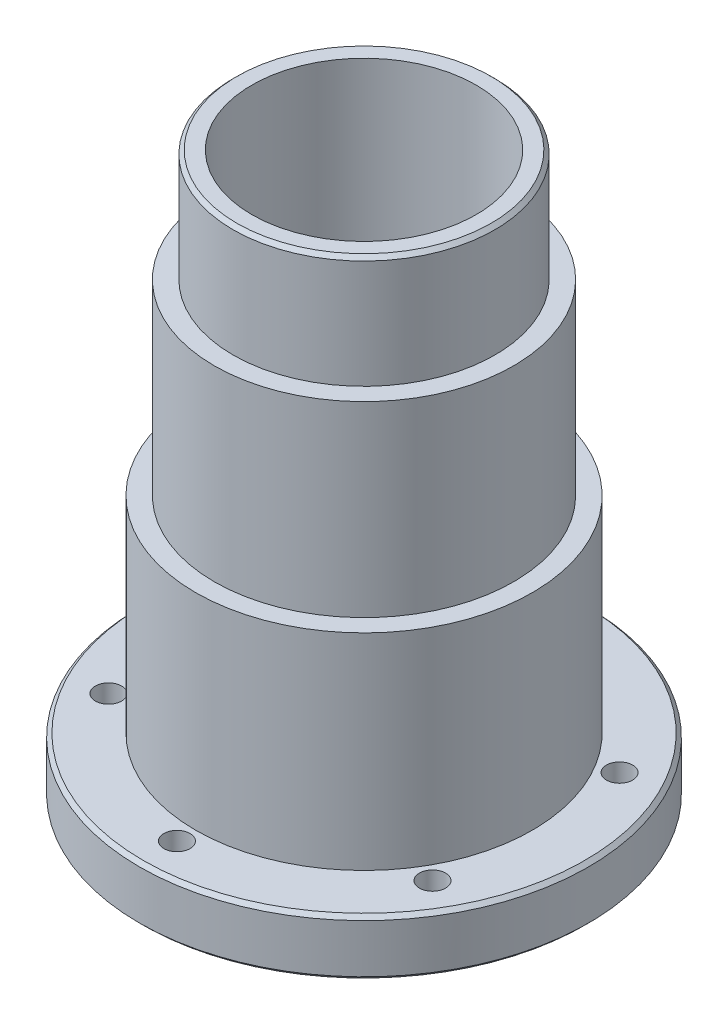
ISO-10303-21;
HEADER;
FILE_DESCRIPTION(('STEP AP214'),'2;1');
FILE_NAME('part.step','',(''),(''),'','','');
FILE_SCHEMA(('AUTOMOTIVE_DESIGN { 1 0 10303 214 1 1 1 1 }'));
ENDSEC;
DATA;
#1=APPLICATION_CONTEXT('core data for automotive mechanical design processes');
#2=APPLICATION_PROTOCOL_DEFINITION('international standard','automotive_design',2000,#1);
#3=PRODUCT_CONTEXT('',#1,'mechanical');
#4=PRODUCT('Part','Part','',(#3));
#5=PRODUCT_RELATED_PRODUCT_CATEGORY('part','',(#4));
#6=PRODUCT_DEFINITION_FORMATION('','',#4);
#7=PRODUCT_DEFINITION_CONTEXT('part definition',#1,'design');
#8=PRODUCT_DEFINITION('design','',#6,#7);
#9=PRODUCT_DEFINITION_SHAPE('','',#8);
#10=(LENGTH_UNIT() NAMED_UNIT(*) SI_UNIT(.MILLI.,.METRE.));
#11=(NAMED_UNIT(*) PLANE_ANGLE_UNIT() SI_UNIT($,.RADIAN.));
#12=(NAMED_UNIT(*) SI_UNIT($,.STERADIAN.) SOLID_ANGLE_UNIT());
#13=UNCERTAINTY_MEASURE_WITH_UNIT(LENGTH_MEASURE(1.E-05),#10,'distance_accuracy_value','');
#14=(GEOMETRIC_REPRESENTATION_CONTEXT(3) GLOBAL_UNCERTAINTY_ASSIGNED_CONTEXT((#13)) GLOBAL_UNIT_ASSIGNED_CONTEXT((#10,
#11,#12)) REPRESENTATION_CONTEXT('',''));
#15=CARTESIAN_POINT('',(0.,0.,0.));
#16=DIRECTION('',(0.,0.,1.));
#17=DIRECTION('',(1.,0.,0.));
#18=AXIS2_PLACEMENT_3D('',#15,#16,#17);
#19=CARTESIAN_POINT('',(0.,75.,17.5));
#20=DIRECTION('',(0.,1.,0.));
#21=DIRECTION('',(0.,0.,1.));
#22=AXIS2_PLACEMENT_3D('',#19,#20,#21);
#23=PLANE('',#22);
#24=CARTESIAN_POINT('',(0.,75.,0.));
#25=DIRECTION('',(0.,1.,0.));
#26=DIRECTION('',(0.,0.,1.));
#27=AXIS2_PLACEMENT_3D('',#24,#25,#26);
#28=CIRCLE('',#27,17.);
#29=CARTESIAN_POINT('',(0.,75.,17.));
#30=VERTEX_POINT('',#29);
#31=EDGE_CURVE('E44',#30,#30,#28,.T.);
#32=ORIENTED_EDGE('',*,*,#31,.T.);
#33=EDGE_LOOP('',(#32));
#34=FACE_BOUND('',#33,.T.);
#35=CARTESIAN_POINT('',(0.,75.,0.));
#36=DIRECTION('',(0.,1.,0.));
#37=DIRECTION('',(0.,0.,1.));
#38=AXIS2_PLACEMENT_3D('',#35,#36,#37);
#39=CIRCLE('',#38,15.);
#40=CARTESIAN_POINT('',(0.,75.,15.));
#41=VERTEX_POINT('',#40);
#42=EDGE_CURVE('E63',#41,#41,#39,.T.);
#43=ORIENTED_EDGE('',*,*,#42,.F.);
#44=EDGE_LOOP('',(#43));
#45=FACE_BOUND('',#44,.T.);
#46=ADVANCED_FACE('F36',(#34,#45),#23,.T.);
#47=CARTESIAN_POINT('',(0.,44.,0.));
#48=DIRECTION('',(0.,1.,0.));
#49=DIRECTION('',(0.,0.,1.));
#50=AXIS2_PLACEMENT_3D('',#47,#48,#49);
#51=CYLINDRICAL_SURFACE('',#50,15.);
#52=ORIENTED_EDGE('',*,*,#42,.T.);
#53=EDGE_LOOP('',(#52));
#54=FACE_BOUND('',#53,.T.);
#55=CARTESIAN_POINT('',(0.,0.,0.));
#56=DIRECTION('',(0.,1.,0.));
#57=DIRECTION('',(0.,0.,1.));
#58=AXIS2_PLACEMENT_3D('',#55,#56,#57);
#59=CIRCLE('',#58,15.);
#60=CARTESIAN_POINT('',(0.,0.,15.));
#61=VERTEX_POINT('',#60);
#62=EDGE_CURVE('E96',#61,#61,#59,.T.);
#63=ORIENTED_EDGE('',*,*,#62,.F.);
#64=EDGE_LOOP('',(#63));
#65=FACE_BOUND('',#64,.T.);
#66=ADVANCED_FACE('F163',(#54,#65),#51,.F.);
#67=CARTESIAN_POINT('',(0.,0.,15.));
#68=DIRECTION('',(0.,-1.,0.));
#69=DIRECTION('',(0.,0.,-1.));
#70=AXIS2_PLACEMENT_3D('',#67,#68,#69);
#71=PLANE('',#70);
#72=CARTESIAN_POINT('',(0.,0.,0.));
#73=DIRECTION('',(0.,-1.,0.));
#74=DIRECTION('',(0.,0.,-1.));
#75=AXIS2_PLACEMENT_3D('',#72,#73,#74);
#76=CIRCLE('',#75,29.5);
#77=CARTESIAN_POINT('',(0.,0.,-29.5));
#78=VERTEX_POINT('',#77);
#79=EDGE_CURVE('E48',#78,#78,#76,.T.);
#80=ORIENTED_EDGE('',*,*,#79,.T.);
#81=EDGE_LOOP('',(#80));
#82=FACE_BOUND('',#81,.T.);
#83=CARTESIAN_POINT('',(-21.6506350946108,0.,12.5000000000003));
#84=DIRECTION('',(0.,-1.,0.));
#85=DIRECTION('',(0.,0.,-1.));
#86=AXIS2_PLACEMENT_3D('',#83,#84,#85);
#87=CIRCLE('',#86,3.);
#88=CARTESIAN_POINT('',(-21.6506350946108,0.,9.50000000000025));
#89=VERTEX_POINT('',#88);
#90=EDGE_CURVE('E153',#89,#89,#87,.T.);
#91=ORIENTED_EDGE('',*,*,#90,.F.);
#92=EDGE_LOOP('',(#91));
#93=FACE_BOUND('',#92,.T.);
#94=CARTESIAN_POINT('',(-21.6506350946111,0.,-12.4999999999998));
#95=DIRECTION('',(0.,-1.,0.));
#96=DIRECTION('',(0.,0.,-1.));
#97=AXIS2_PLACEMENT_3D('',#94,#95,#96);
#98=CIRCLE('',#97,3.);
#99=CARTESIAN_POINT('',(-21.6506350946111,0.,-15.4999999999998));
#100=VERTEX_POINT('',#99);
#101=EDGE_CURVE('E67',#100,#100,#98,.T.);
#102=ORIENTED_EDGE('',*,*,#101,.F.);
#103=EDGE_LOOP('',(#102));
#104=FACE_BOUND('',#103,.T.);
#105=CARTESIAN_POINT('',(0.,0.,-25.));
#106=DIRECTION('',(0.,-1.,0.));
#107=DIRECTION('',(0.,0.,-1.));
#108=AXIS2_PLACEMENT_3D('',#105,#106,#107);
#109=CIRCLE('',#108,3.);
#110=CARTESIAN_POINT('',(0.,0.,-28.));
#111=VERTEX_POINT('',#110);
#112=EDGE_CURVE('E72',#111,#111,#109,.T.);
#113=ORIENTED_EDGE('',*,*,#112,.F.);
#114=EDGE_LOOP('',(#113));
#115=FACE_BOUND('',#114,.T.);
#116=CARTESIAN_POINT('',(21.6506350946109,0.,-12.5000000000001));
#117=DIRECTION('',(0.,-1.,0.));
#118=DIRECTION('',(0.,0.,-1.));
#119=AXIS2_PLACEMENT_3D('',#116,#117,#118);
#120=CIRCLE('',#119,3.);
#121=CARTESIAN_POINT('',(21.6506350946109,0.,-15.5000000000001));
#122=VERTEX_POINT('',#121);
#123=EDGE_CURVE('E77',#122,#122,#120,.T.);
#124=ORIENTED_EDGE('',*,*,#123,.F.);
#125=EDGE_LOOP('',(#124));
#126=FACE_BOUND('',#125,.T.);
#127=CARTESIAN_POINT('',(21.650635094611,0.,12.5));
#128=DIRECTION('',(0.,-1.,0.));
#129=DIRECTION('',(0.,0.,-1.));
#130=AXIS2_PLACEMENT_3D('',#127,#128,#129);
#131=CIRCLE('',#130,3.);
#132=CARTESIAN_POINT('',(21.650635094611,0.,9.49999999999995));
#133=VERTEX_POINT('',#132);
#134=EDGE_CURVE('E82',#133,#133,#131,.T.);
#135=ORIENTED_EDGE('',*,*,#134,.F.);
#136=EDGE_LOOP('',(#135));
#137=FACE_BOUND('',#136,.T.);
#138=CARTESIAN_POINT('',(0.,0.,25.));
#139=DIRECTION('',(0.,-1.,0.));
#140=DIRECTION('',(0.,0.,-1.));
#141=AXIS2_PLACEMENT_3D('',#138,#139,#140);
#142=CIRCLE('',#141,3.);
#143=CARTESIAN_POINT('',(0.,0.,22.));
#144=VERTEX_POINT('',#143);
#145=EDGE_CURVE('E87',#144,#144,#142,.T.);
#146=ORIENTED_EDGE('',*,*,#145,.F.);
#147=EDGE_LOOP('',(#146));
#148=FACE_BOUND('',#147,.T.);
#149=ORIENTED_EDGE('',*,*,#62,.T.);
#150=EDGE_LOOP('',(#149));
#151=FACE_BOUND('',#150,.T.);
#152=ADVANCED_FACE('F159',(#82,#93,#104,#115,#126,#137,#148,#151),#71,.T.);
#153=CARTESIAN_POINT('',(0.,44.,0.));
#154=DIRECTION('',(0.,1.,0.));
#155=DIRECTION('',(0.,0.,1.));
#156=AXIS2_PLACEMENT_3D('',#153,#154,#155);
#157=CYLINDRICAL_SURFACE('',#156,30.);
#158=CARTESIAN_POINT('',(0.,7.00000000000003,0.));
#159=DIRECTION('',(0.,1.,0.));
#160=DIRECTION('',(0.,0.,1.));
#161=AXIS2_PLACEMENT_3D('',#158,#159,#160);
#162=CIRCLE('',#161,30.);
#163=CARTESIAN_POINT('',(0.,7.00000000000003,30.));
#164=VERTEX_POINT('',#163);
#165=EDGE_CURVE('E52',#164,#164,#162,.F.);
#166=ORIENTED_EDGE('',*,*,#165,.T.);
#167=EDGE_LOOP('',(#166));
#168=FACE_BOUND('',#167,.T.);
#169=CARTESIAN_POINT('',(0.,0.499999999999994,0.));
#170=DIRECTION('',(0.,-1.,0.));
#171=DIRECTION('',(0.,0.,-1.));
#172=AXIS2_PLACEMENT_3D('',#169,#170,#171);
#173=CIRCLE('',#172,30.);
#174=CARTESIAN_POINT('',(0.,0.499999999999994,-30.));
#175=VERTEX_POINT('',#174);
#176=EDGE_CURVE('E57',#175,#175,#173,.F.);
#177=ORIENTED_EDGE('',*,*,#176,.T.);
#178=EDGE_LOOP('',(#177));
#179=FACE_BOUND('',#178,.T.);
#180=ADVANCED_FACE('F162',(#168,#179),#157,.T.);
#181=CARTESIAN_POINT('',(0.,7.5,30.));
#182=DIRECTION('',(0.,1.,0.));
#183=DIRECTION('',(0.,0.,1.));
#184=AXIS2_PLACEMENT_3D('',#181,#182,#183);
#185=PLANE('',#184);
#186=CARTESIAN_POINT('',(0.,7.5,0.));
#187=DIRECTION('',(0.,1.,0.));
#188=DIRECTION('',(0.,0.,1.));
#189=AXIS2_PLACEMENT_3D('',#186,#187,#188);
#190=CIRCLE('',#189,29.5);
#191=CARTESIAN_POINT('',(0.,7.5,29.5));
#192=VERTEX_POINT('',#191);
#193=EDGE_CURVE('E60',#192,#192,#190,.T.);
#194=ORIENTED_EDGE('',*,*,#193,.T.);
#195=EDGE_LOOP('',(#194));
#196=FACE_BOUND('',#195,.T.);
#197=CARTESIAN_POINT('',(-21.6506350946108,7.5,12.5000000000003));
#198=DIRECTION('',(0.,1.,0.));
#199=DIRECTION('',(0.,0.,1.));
#200=AXIS2_PLACEMENT_3D('',#197,#198,#199);
#201=CIRCLE('',#200,1.74999999999999);
#202=CARTESIAN_POINT('',(-21.6506350946108,7.5,14.2500000000002));
#203=VERTEX_POINT('',#202);
#204=EDGE_CURVE('E64',#203,#203,#201,.T.);
#205=ORIENTED_EDGE('',*,*,#204,.F.);
#206=EDGE_LOOP('',(#205));
#207=FACE_BOUND('',#206,.T.);
#208=CARTESIAN_POINT('',(-21.6506350946111,7.5,-12.4999999999998));
#209=DIRECTION('',(0.,1.,0.));
#210=DIRECTION('',(0.,0.,1.));
#211=AXIS2_PLACEMENT_3D('',#208,#209,#210);
#212=CIRCLE('',#211,1.74999999999999);
#213=CARTESIAN_POINT('',(-21.6506350946111,7.5,-10.7499999999998));
#214=VERTEX_POINT('',#213);
#215=EDGE_CURVE('E69',#214,#214,#212,.T.);
#216=ORIENTED_EDGE('',*,*,#215,.F.);
#217=EDGE_LOOP('',(#216));
#218=FACE_BOUND('',#217,.T.);
#219=CARTESIAN_POINT('',(0.,7.5,-25.));
#220=DIRECTION('',(0.,1.,0.));
#221=DIRECTION('',(0.,0.,1.));
#222=AXIS2_PLACEMENT_3D('',#219,#220,#221);
#223=CIRCLE('',#222,1.74999999999999);
#224=CARTESIAN_POINT('',(0.,7.5,-23.25));
#225=VERTEX_POINT('',#224);
#226=EDGE_CURVE('E74',#225,#225,#223,.T.);
#227=ORIENTED_EDGE('',*,*,#226,.F.);
#228=EDGE_LOOP('',(#227));
#229=FACE_BOUND('',#228,.T.);
#230=CARTESIAN_POINT('',(21.6506350946109,7.5,-12.5000000000001));
#231=DIRECTION('',(0.,1.,0.));
#232=DIRECTION('',(0.,0.,1.));
#233=AXIS2_PLACEMENT_3D('',#230,#231,#232);
#234=CIRCLE('',#233,1.74999999999999);
#235=CARTESIAN_POINT('',(21.6506350946109,7.5,-10.7500000000001));
#236=VERTEX_POINT('',#235);
#237=EDGE_CURVE('E79',#236,#236,#234,.T.);
#238=ORIENTED_EDGE('',*,*,#237,.F.);
#239=EDGE_LOOP('',(#238));
#240=FACE_BOUND('',#239,.T.);
#241=CARTESIAN_POINT('',(21.650635094611,7.5,12.5));
#242=DIRECTION('',(0.,1.,0.));
#243=DIRECTION('',(0.,0.,1.));
#244=AXIS2_PLACEMENT_3D('',#241,#242,#243);
#245=CIRCLE('',#244,1.74999999999999);
#246=CARTESIAN_POINT('',(21.650635094611,7.5,14.2499999999999));
#247=VERTEX_POINT('',#246);
#248=EDGE_CURVE('E84',#247,#247,#245,.T.);
#249=ORIENTED_EDGE('',*,*,#248,.F.);
#250=EDGE_LOOP('',(#249));
#251=FACE_BOUND('',#250,.T.);
#252=CARTESIAN_POINT('',(0.,7.5,25.));
#253=DIRECTION('',(0.,1.,0.));
#254=DIRECTION('',(0.,0.,1.));
#255=AXIS2_PLACEMENT_3D('',#252,#253,#254);
#256=CIRCLE('',#255,1.74999999999999);
#257=CARTESIAN_POINT('',(0.,7.5,26.75));
#258=VERTEX_POINT('',#257);
#259=EDGE_CURVE('E89',#258,#258,#256,.T.);
#260=ORIENTED_EDGE('',*,*,#259,.F.);
#261=EDGE_LOOP('',(#260));
#262=FACE_BOUND('',#261,.T.);
#263=CARTESIAN_POINT('',(0.,7.5,0.));
#264=DIRECTION('',(0.,1.,0.));
#265=DIRECTION('',(0.,0.,1.));
#266=AXIS2_PLACEMENT_3D('',#263,#264,#265);
#267=CIRCLE('',#266,22.5);
#268=CARTESIAN_POINT('',(0.,7.5,22.5));
#269=VERTEX_POINT('',#268);
#270=EDGE_CURVE('E99',#269,#269,#267,.T.);
#271=ORIENTED_EDGE('',*,*,#270,.F.);
#272=EDGE_LOOP('',(#271));
#273=FACE_BOUND('',#272,.T.);
#274=ADVANCED_FACE('F208',(#196,#207,#218,#229,#240,#251,#262,#273),#185,.T.);
#275=CARTESIAN_POINT('',(0.,44.,0.));
#276=DIRECTION('',(0.,1.,0.));
#277=DIRECTION('',(0.,0.,1.));
#278=AXIS2_PLACEMENT_3D('',#275,#276,#277);
#279=CYLINDRICAL_SURFACE('',#278,22.5);
#280=ORIENTED_EDGE('',*,*,#270,.T.);
#281=EDGE_LOOP('',(#280));
#282=FACE_BOUND('',#281,.T.);
#283=CARTESIAN_POINT('',(0.,35.,0.));
#284=DIRECTION('',(0.,1.,0.));
#285=DIRECTION('',(0.,0.,1.));
#286=AXIS2_PLACEMENT_3D('',#283,#284,#285);
#287=CIRCLE('',#286,22.5);
#288=CARTESIAN_POINT('',(0.,35.,22.5));
#289=VERTEX_POINT('',#288);
#290=EDGE_CURVE('E102',#289,#289,#287,.T.);
#291=ORIENTED_EDGE('',*,*,#290,.F.);
#292=EDGE_LOOP('',(#291));
#293=FACE_BOUND('',#292,.T.);
#294=ADVANCED_FACE('F213',(#282,#293),#279,.T.);
#295=CARTESIAN_POINT('',(0.,35.,22.5));
#296=DIRECTION('',(0.,1.,0.));
#297=DIRECTION('',(0.,0.,1.));
#298=AXIS2_PLACEMENT_3D('',#295,#296,#297);
#299=PLANE('',#298);
#300=ORIENTED_EDGE('',*,*,#290,.T.);
#301=EDGE_LOOP('',(#300));
#302=FACE_BOUND('',#301,.T.);
#303=CARTESIAN_POINT('',(0.,35.,0.));
#304=DIRECTION('',(0.,1.,0.));
#305=DIRECTION('',(0.,0.,1.));
#306=AXIS2_PLACEMENT_3D('',#303,#304,#305);
#307=CIRCLE('',#306,20.);
#308=CARTESIAN_POINT('',(0.,35.,20.));
#309=VERTEX_POINT('',#308);
#310=EDGE_CURVE('E105',#309,#309,#307,.T.);
#311=ORIENTED_EDGE('',*,*,#310,.F.);
#312=EDGE_LOOP('',(#311));
#313=FACE_BOUND('',#312,.T.);
#314=ADVANCED_FACE('F219',(#302,#313),#299,.T.);
#315=CARTESIAN_POINT('',(0.,44.,0.));
#316=DIRECTION('',(0.,1.,0.));
#317=DIRECTION('',(0.,0.,1.));
#318=AXIS2_PLACEMENT_3D('',#315,#316,#317);
#319=CYLINDRICAL_SURFACE('',#318,20.);
#320=ORIENTED_EDGE('',*,*,#310,.T.);
#321=EDGE_LOOP('',(#320));
#322=FACE_BOUND('',#321,.T.);
#323=CARTESIAN_POINT('',(0.,60.,0.));
#324=DIRECTION('',(0.,1.,0.));
#325=DIRECTION('',(0.,0.,1.));
#326=AXIS2_PLACEMENT_3D('',#323,#324,#325);
#327=CIRCLE('',#326,20.);
#328=CARTESIAN_POINT('',(0.,60.,20.));
#329=VERTEX_POINT('',#328);
#330=EDGE_CURVE('E108',#329,#329,#327,.T.);
#331=ORIENTED_EDGE('',*,*,#330,.F.);
#332=EDGE_LOOP('',(#331));
#333=FACE_BOUND('',#332,.T.);
#334=ADVANCED_FACE('F223',(#322,#333),#319,.T.);
#335=CARTESIAN_POINT('',(0.,60.,20.));
#336=DIRECTION('',(0.,1.,0.));
#337=DIRECTION('',(0.,0.,1.));
#338=AXIS2_PLACEMENT_3D('',#335,#336,#337);
#339=PLANE('',#338);
#340=ORIENTED_EDGE('',*,*,#330,.T.);
#341=EDGE_LOOP('',(#340));
#342=FACE_BOUND('',#341,.T.);
#343=CARTESIAN_POINT('',(0.,60.,0.));
#344=DIRECTION('',(0.,1.,0.));
#345=DIRECTION('',(0.,0.,1.));
#346=AXIS2_PLACEMENT_3D('',#343,#344,#345);
#347=CIRCLE('',#346,17.5);
#348=CARTESIAN_POINT('',(0.,60.,17.5));
#349=VERTEX_POINT('',#348);
#350=EDGE_CURVE('E92',#349,#349,#347,.T.);
#351=ORIENTED_EDGE('',*,*,#350,.F.);
#352=EDGE_LOOP('',(#351));
#353=FACE_BOUND('',#352,.T.);
#354=ADVANCED_FACE('F227',(#342,#353),#339,.T.);
#355=CARTESIAN_POINT('',(0.,44.,0.));
#356=DIRECTION('',(0.,1.,0.));
#357=DIRECTION('',(0.,0.,1.));
#358=AXIS2_PLACEMENT_3D('',#355,#356,#357);
#359=CYLINDRICAL_SURFACE('',#358,17.5);
#360=CARTESIAN_POINT('',(0.,74.5,0.));
#361=DIRECTION('',(0.,1.,0.));
#362=DIRECTION('',(0.,0.,1.));
#363=AXIS2_PLACEMENT_3D('',#360,#361,#362);
#364=CIRCLE('',#363,17.5);
#365=CARTESIAN_POINT('',(0.,74.5,17.5));
#366=VERTEX_POINT('',#365);
#367=EDGE_CURVE('E10',#366,#366,#364,.F.);
#368=ORIENTED_EDGE('',*,*,#367,.T.);
#369=EDGE_LOOP('',(#368));
#370=FACE_BOUND('',#369,.T.);
#371=ORIENTED_EDGE('',*,*,#350,.T.);
#372=EDGE_LOOP('',(#371));
#373=FACE_BOUND('',#372,.T.);
#374=ADVANCED_FACE('F231',(#370,#373),#359,.T.);
#375=CARTESIAN_POINT('',(0.,0.,25.));
#376=DIRECTION('',(0.,-1.,0.));
#377=DIRECTION('',(0.,0.,-1.));
#378=AXIS2_PLACEMENT_3D('',#375,#376,#377);
#379=CYLINDRICAL_SURFACE('',#378,1.74999999999999);
#380=ORIENTED_EDGE('',*,*,#259,.T.);
#381=EDGE_LOOP('',(#380));
#382=FACE_BOUND('',#381,.T.);
#383=CARTESIAN_POINT('',(0.,4.,25.));
#384=DIRECTION('',(0.,-1.,0.));
#385=DIRECTION('',(0.,0.,-1.));
#386=AXIS2_PLACEMENT_3D('',#383,#384,#385);
#387=CIRCLE('',#386,1.75000000000001);
#388=CARTESIAN_POINT('',(0.,4.,23.25));
#389=VERTEX_POINT('',#388);
#390=EDGE_CURVE('E93',#389,#389,#387,.T.);
#391=ORIENTED_EDGE('',*,*,#390,.T.);
#392=EDGE_LOOP('',(#391));
#393=FACE_BOUND('',#392,.T.);
#394=ADVANCED_FACE('F235',(#382,#393),#379,.F.);
#395=CARTESIAN_POINT('',(1.75000000000001,4.,25.));
#396=DIRECTION('',(0.,1.,0.));
#397=DIRECTION('',(0.,0.,1.));
#398=AXIS2_PLACEMENT_3D('',#395,#396,#397);
#399=PLANE('',#398);
#400=ORIENTED_EDGE('',*,*,#390,.F.);
#401=EDGE_LOOP('',(#400));
#402=FACE_BOUND('',#401,.T.);
#403=CARTESIAN_POINT('',(0.,4.,25.));
#404=DIRECTION('',(0.,-1.,0.));
#405=DIRECTION('',(0.,0.,-1.));
#406=AXIS2_PLACEMENT_3D('',#403,#404,#405);
#407=CIRCLE('',#406,3.);
#408=CARTESIAN_POINT('',(0.,4.,22.));
#409=VERTEX_POINT('',#408);
#410=EDGE_CURVE('E115',#409,#409,#407,.T.);
#411=ORIENTED_EDGE('',*,*,#410,.T.);
#412=EDGE_LOOP('',(#411));
#413=FACE_BOUND('',#412,.T.);
#414=ADVANCED_FACE('F238',(#402,#413),#399,.F.);
#415=CARTESIAN_POINT('',(0.,0.,25.));
#416=DIRECTION('',(0.,-1.,0.));
#417=DIRECTION('',(0.,0.,-1.));
#418=AXIS2_PLACEMENT_3D('',#415,#416,#417);
#419=CYLINDRICAL_SURFACE('',#418,3.);
#420=ORIENTED_EDGE('',*,*,#410,.F.);
#421=EDGE_LOOP('',(#420));
#422=FACE_BOUND('',#421,.T.);
#423=ORIENTED_EDGE('',*,*,#145,.T.);
#424=EDGE_LOOP('',(#423));
#425=FACE_BOUND('',#424,.T.);
#426=ADVANCED_FACE('F242',(#422,#425),#419,.F.);
#427=CARTESIAN_POINT('',(21.650635094611,0.,12.5));
#428=DIRECTION('',(0.,-1.,0.));
#429=DIRECTION('',(0.,0.,-1.));
#430=AXIS2_PLACEMENT_3D('',#427,#428,#429);
#431=CYLINDRICAL_SURFACE('',#430,1.74999999999999);
#432=ORIENTED_EDGE('',*,*,#248,.T.);
#433=EDGE_LOOP('',(#432));
#434=FACE_BOUND('',#433,.T.);
#435=CARTESIAN_POINT('',(21.650635094611,4.,12.5));
#436=DIRECTION('',(0.,-1.,0.));
#437=DIRECTION('',(0.,0.,-1.));
#438=AXIS2_PLACEMENT_3D('',#435,#436,#437);
#439=CIRCLE('',#438,1.75000000000001);
#440=CARTESIAN_POINT('',(21.650635094611,4.,10.7499999999999));
#441=VERTEX_POINT('',#440);
#442=EDGE_CURVE('E88',#441,#441,#439,.T.);
#443=ORIENTED_EDGE('',*,*,#442,.T.);
#444=EDGE_LOOP('',(#443));
#445=FACE_BOUND('',#444,.T.);
#446=ADVANCED_FACE('F246',(#434,#445),#431,.F.);
#447=CARTESIAN_POINT('',(23.400635094611,4.,12.5));
#448=DIRECTION('',(0.,1.,0.));
#449=DIRECTION('',(0.,0.,1.));
#450=AXIS2_PLACEMENT_3D('',#447,#448,#449);
#451=PLANE('',#450);
#452=ORIENTED_EDGE('',*,*,#442,.F.);
#453=EDGE_LOOP('',(#452));
#454=FACE_BOUND('',#453,.T.);
#455=CARTESIAN_POINT('',(21.650635094611,4.,12.5));
#456=DIRECTION('',(0.,-1.,0.));
#457=DIRECTION('',(0.,0.,-1.));
#458=AXIS2_PLACEMENT_3D('',#455,#456,#457);
#459=CIRCLE('',#458,3.);
#460=CARTESIAN_POINT('',(21.650635094611,4.,9.49999999999995));
#461=VERTEX_POINT('',#460);
#462=EDGE_CURVE('E122',#461,#461,#459,.T.);
#463=ORIENTED_EDGE('',*,*,#462,.T.);
#464=EDGE_LOOP('',(#463));
#465=FACE_BOUND('',#464,.T.);
#466=ADVANCED_FACE('F250',(#454,#465),#451,.F.);
#467=CARTESIAN_POINT('',(21.650635094611,0.,12.5));
#468=DIRECTION('',(0.,-1.,0.));
#469=DIRECTION('',(0.,0.,-1.));
#470=AXIS2_PLACEMENT_3D('',#467,#468,#469);
#471=CYLINDRICAL_SURFACE('',#470,3.);
#472=ORIENTED_EDGE('',*,*,#462,.F.);
#473=EDGE_LOOP('',(#472));
#474=FACE_BOUND('',#473,.T.);
#475=ORIENTED_EDGE('',*,*,#134,.T.);
#476=EDGE_LOOP('',(#475));
#477=FACE_BOUND('',#476,.T.);
#478=ADVANCED_FACE('F254',(#474,#477),#471,.F.);
#479=CARTESIAN_POINT('',(21.6506350946109,0.,-12.5000000000001));
#480=DIRECTION('',(0.,-1.,0.));
#481=DIRECTION('',(0.,0.,-1.));
#482=AXIS2_PLACEMENT_3D('',#479,#480,#481);
#483=CYLINDRICAL_SURFACE('',#482,1.74999999999999);
#484=ORIENTED_EDGE('',*,*,#237,.T.);
#485=EDGE_LOOP('',(#484));
#486=FACE_BOUND('',#485,.T.);
#487=CARTESIAN_POINT('',(21.6506350946109,4.,-12.5000000000001));
#488=DIRECTION('',(0.,-1.,0.));
#489=DIRECTION('',(0.,0.,-1.));
#490=AXIS2_PLACEMENT_3D('',#487,#488,#489);
#491=CIRCLE('',#490,1.75000000000001);
#492=CARTESIAN_POINT('',(21.6506350946109,4.,-14.2500000000001));
#493=VERTEX_POINT('',#492);
#494=EDGE_CURVE('E83',#493,#493,#491,.T.);
#495=ORIENTED_EDGE('',*,*,#494,.T.);
#496=EDGE_LOOP('',(#495));
#497=FACE_BOUND('',#496,.T.);
#498=ADVANCED_FACE('F258',(#486,#497),#483,.F.);
#499=CARTESIAN_POINT('',(23.4006350946109,4.,-12.5000000000001));
#500=DIRECTION('',(0.,1.,0.));
#501=DIRECTION('',(0.,0.,1.));
#502=AXIS2_PLACEMENT_3D('',#499,#500,#501);
#503=PLANE('',#502);
#504=ORIENTED_EDGE('',*,*,#494,.F.);
#505=EDGE_LOOP('',(#504));
#506=FACE_BOUND('',#505,.T.);
#507=CARTESIAN_POINT('',(21.6506350946109,4.,-12.5000000000001));
#508=DIRECTION('',(0.,-1.,0.));
#509=DIRECTION('',(0.,0.,-1.));
#510=AXIS2_PLACEMENT_3D('',#507,#508,#509);
#511=CIRCLE('',#510,3.);
#512=CARTESIAN_POINT('',(21.6506350946109,4.,-15.5000000000001));
#513=VERTEX_POINT('',#512);
#514=EDGE_CURVE('E129',#513,#513,#511,.T.);
#515=ORIENTED_EDGE('',*,*,#514,.T.);
#516=EDGE_LOOP('',(#515));
#517=FACE_BOUND('',#516,.T.);
#518=ADVANCED_FACE('F262',(#506,#517),#503,.F.);
#519=CARTESIAN_POINT('',(21.6506350946109,0.,-12.5000000000001));
#520=DIRECTION('',(0.,-1.,0.));
#521=DIRECTION('',(0.,0.,-1.));
#522=AXIS2_PLACEMENT_3D('',#519,#520,#521);
#523=CYLINDRICAL_SURFACE('',#522,3.);
#524=ORIENTED_EDGE('',*,*,#514,.F.);
#525=EDGE_LOOP('',(#524));
#526=FACE_BOUND('',#525,.T.);
#527=ORIENTED_EDGE('',*,*,#123,.T.);
#528=EDGE_LOOP('',(#527));
#529=FACE_BOUND('',#528,.T.);
#530=ADVANCED_FACE('F266',(#526,#529),#523,.F.);
#531=CARTESIAN_POINT('',(0.,0.,-25.));
#532=DIRECTION('',(0.,-1.,0.));
#533=DIRECTION('',(0.,0.,-1.));
#534=AXIS2_PLACEMENT_3D('',#531,#532,#533);
#535=CYLINDRICAL_SURFACE('',#534,1.74999999999999);
#536=ORIENTED_EDGE('',*,*,#226,.T.);
#537=EDGE_LOOP('',(#536));
#538=FACE_BOUND('',#537,.T.);
#539=CARTESIAN_POINT('',(0.,4.,-25.));
#540=DIRECTION('',(0.,-1.,0.));
#541=DIRECTION('',(0.,0.,-1.));
#542=AXIS2_PLACEMENT_3D('',#539,#540,#541);
#543=CIRCLE('',#542,1.75000000000001);
#544=CARTESIAN_POINT('',(0.,4.,-26.75));
#545=VERTEX_POINT('',#544);
#546=EDGE_CURVE('E78',#545,#545,#543,.T.);
#547=ORIENTED_EDGE('',*,*,#546,.T.);
#548=EDGE_LOOP('',(#547));
#549=FACE_BOUND('',#548,.T.);
#550=ADVANCED_FACE('F270',(#538,#549),#535,.F.);
#551=CARTESIAN_POINT('',(1.75000000000001,4.,-25.));
#552=DIRECTION('',(0.,1.,0.));
#553=DIRECTION('',(0.,0.,1.));
#554=AXIS2_PLACEMENT_3D('',#551,#552,#553);
#555=PLANE('',#554);
#556=ORIENTED_EDGE('',*,*,#546,.F.);
#557=EDGE_LOOP('',(#556));
#558=FACE_BOUND('',#557,.T.);
#559=CARTESIAN_POINT('',(0.,4.,-25.));
#560=DIRECTION('',(0.,-1.,0.));
#561=DIRECTION('',(0.,0.,-1.));
#562=AXIS2_PLACEMENT_3D('',#559,#560,#561);
#563=CIRCLE('',#562,3.);
#564=CARTESIAN_POINT('',(0.,4.,-28.));
#565=VERTEX_POINT('',#564);
#566=EDGE_CURVE('E136',#565,#565,#563,.T.);
#567=ORIENTED_EDGE('',*,*,#566,.T.);
#568=EDGE_LOOP('',(#567));
#569=FACE_BOUND('',#568,.T.);
#570=ADVANCED_FACE('F274',(#558,#569),#555,.F.);
#571=CARTESIAN_POINT('',(0.,0.,-25.));
#572=DIRECTION('',(0.,-1.,0.));
#573=DIRECTION('',(0.,0.,-1.));
#574=AXIS2_PLACEMENT_3D('',#571,#572,#573);
#575=CYLINDRICAL_SURFACE('',#574,3.);
#576=ORIENTED_EDGE('',*,*,#566,.F.);
#577=EDGE_LOOP('',(#576));
#578=FACE_BOUND('',#577,.T.);
#579=ORIENTED_EDGE('',*,*,#112,.T.);
#580=EDGE_LOOP('',(#579));
#581=FACE_BOUND('',#580,.T.);
#582=ADVANCED_FACE('F278',(#578,#581),#575,.F.);
#583=CARTESIAN_POINT('',(-21.6506350946111,0.,-12.4999999999998));
#584=DIRECTION('',(0.,-1.,0.));
#585=DIRECTION('',(0.,0.,-1.));
#586=AXIS2_PLACEMENT_3D('',#583,#584,#585);
#587=CYLINDRICAL_SURFACE('',#586,1.74999999999999);
#588=ORIENTED_EDGE('',*,*,#215,.T.);
#589=EDGE_LOOP('',(#588));
#590=FACE_BOUND('',#589,.T.);
#591=CARTESIAN_POINT('',(-21.6506350946111,4.,-12.4999999999998));
#592=DIRECTION('',(0.,-1.,0.));
#593=DIRECTION('',(0.,0.,-1.));
#594=AXIS2_PLACEMENT_3D('',#591,#592,#593);
#595=CIRCLE('',#594,1.75000000000001);
#596=CARTESIAN_POINT('',(-21.6506350946111,4.,-14.2499999999998));
#597=VERTEX_POINT('',#596);
#598=EDGE_CURVE('E73',#597,#597,#595,.T.);
#599=ORIENTED_EDGE('',*,*,#598,.T.);
#600=EDGE_LOOP('',(#599));
#601=FACE_BOUND('',#600,.T.);
#602=ADVANCED_FACE('F282',(#590,#601),#587,.F.);
#603=CARTESIAN_POINT('',(-19.9006350946111,4.,-12.4999999999998));
#604=DIRECTION('',(0.,1.,0.));
#605=DIRECTION('',(0.,0.,1.));
#606=AXIS2_PLACEMENT_3D('',#603,#604,#605);
#607=PLANE('',#606);
#608=ORIENTED_EDGE('',*,*,#598,.F.);
#609=EDGE_LOOP('',(#608));
#610=FACE_BOUND('',#609,.T.);
#611=CARTESIAN_POINT('',(-21.6506350946111,4.,-12.4999999999998));
#612=DIRECTION('',(0.,-1.,0.));
#613=DIRECTION('',(0.,0.,-1.));
#614=AXIS2_PLACEMENT_3D('',#611,#612,#613);
#615=CIRCLE('',#614,3.);
#616=CARTESIAN_POINT('',(-21.6506350946111,4.,-15.4999999999998));
#617=VERTEX_POINT('',#616);
#618=EDGE_CURVE('E143',#617,#617,#615,.T.);
#619=ORIENTED_EDGE('',*,*,#618,.T.);
#620=EDGE_LOOP('',(#619));
#621=FACE_BOUND('',#620,.T.);
#622=ADVANCED_FACE('F286',(#610,#621),#607,.F.);
#623=CARTESIAN_POINT('',(-21.6506350946111,0.,-12.4999999999998));
#624=DIRECTION('',(0.,-1.,0.));
#625=DIRECTION('',(0.,0.,-1.));
#626=AXIS2_PLACEMENT_3D('',#623,#624,#625);
#627=CYLINDRICAL_SURFACE('',#626,3.);
#628=ORIENTED_EDGE('',*,*,#618,.F.);
#629=EDGE_LOOP('',(#628));
#630=FACE_BOUND('',#629,.T.);
#631=ORIENTED_EDGE('',*,*,#101,.T.);
#632=EDGE_LOOP('',(#631));
#633=FACE_BOUND('',#632,.T.);
#634=ADVANCED_FACE('F290',(#630,#633),#627,.F.);
#635=CARTESIAN_POINT('',(-21.6506350946108,0.,12.5000000000003));
#636=DIRECTION('',(0.,-1.,0.));
#637=DIRECTION('',(0.,0.,-1.));
#638=AXIS2_PLACEMENT_3D('',#635,#636,#637);
#639=CYLINDRICAL_SURFACE('',#638,1.74999999999999);
#640=ORIENTED_EDGE('',*,*,#204,.T.);
#641=EDGE_LOOP('',(#640));
#642=FACE_BOUND('',#641,.T.);
#643=CARTESIAN_POINT('',(-21.6506350946108,4.,12.5000000000003));
#644=DIRECTION('',(0.,-1.,0.));
#645=DIRECTION('',(0.,0.,-1.));
#646=AXIS2_PLACEMENT_3D('',#643,#644,#645);
#647=CIRCLE('',#646,1.75000000000001);
#648=CARTESIAN_POINT('',(-21.6506350946108,4.,10.7500000000002));
#649=VERTEX_POINT('',#648);
#650=EDGE_CURVE('E68',#649,#649,#647,.T.);
#651=ORIENTED_EDGE('',*,*,#650,.T.);
#652=EDGE_LOOP('',(#651));
#653=FACE_BOUND('',#652,.T.);
#654=ADVANCED_FACE('F294',(#642,#653),#639,.F.);
#655=CARTESIAN_POINT('',(-19.9006350946108,4.,12.5000000000003));
#656=DIRECTION('',(0.,1.,0.));
#657=DIRECTION('',(0.,0.,1.));
#658=AXIS2_PLACEMENT_3D('',#655,#656,#657);
#659=PLANE('',#658);
#660=ORIENTED_EDGE('',*,*,#650,.F.);
#661=EDGE_LOOP('',(#660));
#662=FACE_BOUND('',#661,.T.);
#663=CARTESIAN_POINT('',(-21.6506350946108,4.,12.5000000000003));
#664=DIRECTION('',(0.,-1.,0.));
#665=DIRECTION('',(0.,0.,-1.));
#666=AXIS2_PLACEMENT_3D('',#663,#664,#665);
#667=CIRCLE('',#666,3.);
#668=CARTESIAN_POINT('',(-21.6506350946108,4.,9.50000000000025));
#669=VERTEX_POINT('',#668);
#670=EDGE_CURVE('E150',#669,#669,#667,.T.);
#671=ORIENTED_EDGE('',*,*,#670,.T.);
#672=EDGE_LOOP('',(#671));
#673=FACE_BOUND('',#672,.T.);
#674=ADVANCED_FACE('F298',(#662,#673),#659,.F.);
#675=CARTESIAN_POINT('',(-21.6506350946108,0.,12.5000000000003));
#676=DIRECTION('',(0.,-1.,0.));
#677=DIRECTION('',(0.,0.,-1.));
#678=AXIS2_PLACEMENT_3D('',#675,#676,#677);
#679=CYLINDRICAL_SURFACE('',#678,3.);
#680=ORIENTED_EDGE('',*,*,#670,.F.);
#681=EDGE_LOOP('',(#680));
#682=FACE_BOUND('',#681,.T.);
#683=ORIENTED_EDGE('',*,*,#90,.T.);
#684=EDGE_LOOP('',(#683));
#685=FACE_BOUND('',#684,.T.);
#686=ADVANCED_FACE('F157',(#682,#685),#679,.F.);
#687=CARTESIAN_POINT('',(0.,7.5,0.));
#688=DIRECTION('',(0.,-1.,0.));
#689=DIRECTION('',(0.,0.,-1.));
#690=AXIS2_PLACEMENT_3D('',#687,#688,#689);
#691=CONICAL_SURFACE('',#690,29.5,0.785398163397455);
#692=ORIENTED_EDGE('',*,*,#165,.F.);
#693=EDGE_LOOP('',(#692));
#694=FACE_BOUND('',#693,.T.);
#695=ORIENTED_EDGE('',*,*,#193,.F.);
#696=EDGE_LOOP('',(#695));
#697=FACE_BOUND('',#696,.T.);
#698=ADVANCED_FACE('F188',(#694,#697),#691,.T.);
#699=CARTESIAN_POINT('',(0.,0.499999999999994,0.));
#700=DIRECTION('',(0.,1.,0.));
#701=DIRECTION('',(0.,0.,1.));
#702=AXIS2_PLACEMENT_3D('',#699,#700,#701);
#703=CONICAL_SURFACE('',#702,30.,0.785398163397448);
#704=ORIENTED_EDGE('',*,*,#79,.F.);
#705=EDGE_LOOP('',(#704));
#706=FACE_BOUND('',#705,.T.);
#707=ORIENTED_EDGE('',*,*,#176,.F.);
#708=EDGE_LOOP('',(#707));
#709=FACE_BOUND('',#708,.T.);
#710=ADVANCED_FACE('F193',(#706,#709),#703,.T.);
#711=CARTESIAN_POINT('',(0.,75.,0.));
#712=DIRECTION('',(0.,-1.,0.));
#713=DIRECTION('',(0.,0.,-1.));
#714=AXIS2_PLACEMENT_3D('',#711,#712,#713);
#715=CONICAL_SURFACE('',#714,17.,0.785398163397445);
#716=ORIENTED_EDGE('',*,*,#367,.F.);
#717=EDGE_LOOP('',(#716));
#718=FACE_BOUND('',#717,.T.);
#719=ORIENTED_EDGE('',*,*,#31,.F.);
#720=EDGE_LOOP('',(#719));
#721=FACE_BOUND('',#720,.T.);
#722=ADVANCED_FACE('F39',(#718,#721),#715,.T.);
#723=CLOSED_SHELL('',(#46,#66,#152,#180,#274,#294,#314,#334,#354,#374,#394,#414,#426,#446,#466,
#478,#498,#518,#530,#550,#570,#582,#602,#622,#634,#654,#674,#686,#698,#710,#722));
#724=MANIFOLD_SOLID_BREP('B2',#723);
#725=ADVANCED_BREP_SHAPE_REPRESENTATION('',(#18,#724),#14);
#726=SHAPE_DEFINITION_REPRESENTATION(#9,#725);
ENDSEC;
END-ISO-10303-21;
